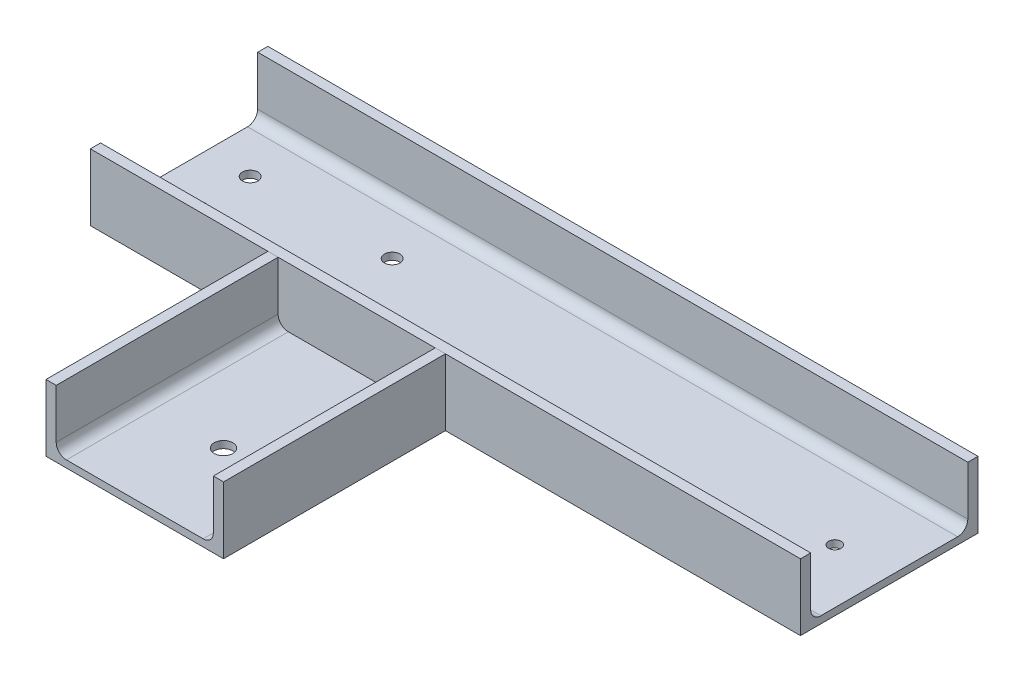
ISO-10303-21;
HEADER;
FILE_DESCRIPTION(('STEP AP214'),'2;1');
FILE_NAME('part.step','',(''),(''),'','','');
FILE_SCHEMA(('AUTOMOTIVE_DESIGN { 1 0 10303 214 1 1 1 1 }'));
ENDSEC;
DATA;
#1=APPLICATION_CONTEXT('core data for automotive mechanical design processes');
#2=APPLICATION_PROTOCOL_DEFINITION('international standard','automotive_design',2000,#1);
#3=PRODUCT_CONTEXT('',#1,'mechanical');
#4=PRODUCT('Part','Part','',(#3));
#5=PRODUCT_RELATED_PRODUCT_CATEGORY('part','',(#4));
#6=PRODUCT_DEFINITION_FORMATION('','',#4);
#7=PRODUCT_DEFINITION_CONTEXT('part definition',#1,'design');
#8=PRODUCT_DEFINITION('design','',#6,#7);
#9=PRODUCT_DEFINITION_SHAPE('','',#8);
#10=(LENGTH_UNIT() NAMED_UNIT(*) SI_UNIT(.MILLI.,.METRE.));
#11=(NAMED_UNIT(*) PLANE_ANGLE_UNIT() SI_UNIT($,.RADIAN.));
#12=(NAMED_UNIT(*) SI_UNIT($,.STERADIAN.) SOLID_ANGLE_UNIT());
#13=UNCERTAINTY_MEASURE_WITH_UNIT(LENGTH_MEASURE(1.E-05),#10,'distance_accuracy_value','');
#14=(GEOMETRIC_REPRESENTATION_CONTEXT(3) GLOBAL_UNCERTAINTY_ASSIGNED_CONTEXT((#13)) GLOBAL_UNIT_ASSIGNED_CONTEXT((#10,
#11,#12)) REPRESENTATION_CONTEXT('',''));
#15=CARTESIAN_POINT('',(0.,0.,0.));
#16=DIRECTION('',(0.,0.,1.));
#17=DIRECTION('',(1.,0.,0.));
#18=AXIS2_PLACEMENT_3D('',#15,#16,#17);
#19=CARTESIAN_POINT('',(-1.38777878078145E-13,75.0000000000003,250.));
#20=DIRECTION('',(-1.,0.,0.));
#21=DIRECTION('',(0.,-1.,0.));
#22=AXIS2_PLACEMENT_3D('',#19,#20,#21);
#23=PLANE('',#22);
#24=DIRECTION('',(0.,1.,0.));
#25=VECTOR('',#24,1.);
#26=CARTESIAN_POINT('',(-1.80411241501588E-13,75.0000000000003,0.));
#27=LINE('',#26,#25);
#28=CARTESIAN_POINT('',(0.,3.7470027081099E-13,0.));
#29=VERTEX_POINT('',#28);
#30=CARTESIAN_POINT('',(-1.80411241501588E-13,75.0000000000003,0.));
#31=VERTEX_POINT('',#30);
#32=EDGE_CURVE('E222',#29,#31,#27,.T.);
#33=ORIENTED_EDGE('',*,*,#32,.T.);
#34=DIRECTION('',(0.,0.,-1.));
#35=VECTOR('',#34,1.);
#36=CARTESIAN_POINT('',(-1.38777878078145E-13,75.0000000000003,250.));
#37=LINE('',#36,#35);
#38=CARTESIAN_POINT('',(-1.38777878078145E-13,75.0000000000003,250.));
#39=VERTEX_POINT('',#38);
#40=EDGE_CURVE('E14',#39,#31,#37,.T.);
#41=ORIENTED_EDGE('',*,*,#40,.F.);
#42=DIRECTION('',(0.,1.,0.));
#43=VECTOR('',#42,1.);
#44=CARTESIAN_POINT('',(-1.38777878078145E-13,75.0000000000003,250.));
#45=LINE('',#44,#43);
#46=CARTESIAN_POINT('',(1.2490009027033E-13,3.7470027081099E-13,250.));
#47=VERTEX_POINT('',#46);
#48=EDGE_CURVE('E240',#47,#39,#45,.T.);
#49=ORIENTED_EDGE('',*,*,#48,.F.);
#50=DIRECTION('',(0.,0.,-1.));
#51=VECTOR('',#50,1.);
#52=CARTESIAN_POINT('',(1.2490009027033E-13,3.7470027081099E-13,250.));
#53=LINE('',#52,#51);
#54=EDGE_CURVE('E218',#47,#29,#53,.T.);
#55=ORIENTED_EDGE('',*,*,#54,.T.);
#56=EDGE_LOOP('',(#33,#41,#49,#55));
#57=FACE_BOUND('',#56,.T.);
#58=ADVANCED_FACE('F113',(#57),#23,.F.);
#59=CARTESIAN_POINT('',(-1.38777878078145E-13,75.0000000000003,250.));
#60=DIRECTION('',(0.,-1.,0.));
#61=DIRECTION('',(1.,0.,0.));
#62=AXIS2_PLACEMENT_3D('',#59,#60,#61);
#63=PLANE('',#62);
#64=DIRECTION('',(-1.,0.,0.));
#65=VECTOR('',#64,1.);
#66=CARTESIAN_POINT('',(-1.80411241501588E-13,75.0000000000003,0.));
#67=LINE('',#66,#65);
#68=CARTESIAN_POINT('',(-11.5000000000002,75.0000000000003,0.));
#69=VERTEX_POINT('',#68);
#70=EDGE_CURVE('E225',#31,#69,#67,.T.);
#71=ORIENTED_EDGE('',*,*,#70,.T.);
#72=DIRECTION('',(0.,0.,-1.));
#73=VECTOR('',#72,1.);
#74=CARTESIAN_POINT('',(-11.5000000000001,75.0000000000003,250.));
#75=LINE('',#74,#73);
#76=CARTESIAN_POINT('',(-11.5000000000001,75.0000000000003,250.));
#77=VERTEX_POINT('',#76);
#78=EDGE_CURVE('E122',#77,#69,#75,.T.);
#79=ORIENTED_EDGE('',*,*,#78,.F.);
#80=DIRECTION('',(-1.,0.,0.));
#81=VECTOR('',#80,1.);
#82=CARTESIAN_POINT('',(-1.38777878078145E-13,75.0000000000003,250.));
#83=LINE('',#82,#81);
#84=EDGE_CURVE('E179',#39,#77,#83,.T.);
#85=ORIENTED_EDGE('',*,*,#84,.F.);
#86=ORIENTED_EDGE('',*,*,#40,.T.);
#87=EDGE_LOOP('',(#71,#79,#85,#86));
#88=FACE_BOUND('',#87,.T.);
#89=ADVANCED_FACE('F306',(#88),#63,.F.);
#90=CARTESIAN_POINT('',(-11.4999999999999,19.5000000000003,250.));
#91=DIRECTION('',(1.,0.,0.));
#92=DIRECTION('',(0.,1.,0.));
#93=AXIS2_PLACEMENT_3D('',#90,#91,#92);
#94=PLANE('',#93);
#95=DIRECTION('',(0.,-1.,0.));
#96=VECTOR('',#95,1.);
#97=CARTESIAN_POINT('',(-11.5,19.5000000000003,0.));
#98=LINE('',#97,#96);
#99=CARTESIAN_POINT('',(-11.5,19.5000000000003,0.));
#100=VERTEX_POINT('',#99);
#101=EDGE_CURVE('E227',#69,#100,#98,.T.);
#102=ORIENTED_EDGE('',*,*,#101,.T.);
#103=DIRECTION('',(0.,0.,-1.));
#104=VECTOR('',#103,1.);
#105=CARTESIAN_POINT('',(-11.4999999999999,19.5000000000003,250.));
#106=LINE('',#105,#104);
#107=CARTESIAN_POINT('',(-11.4999999999999,19.5000000000003,250.));
#108=VERTEX_POINT('',#107);
#109=EDGE_CURVE('E253',#108,#100,#106,.T.);
#110=ORIENTED_EDGE('',*,*,#109,.F.);
#111=DIRECTION('',(0.,-1.,0.));
#112=VECTOR('',#111,1.);
#113=CARTESIAN_POINT('',(-11.4999999999999,19.5000000000003,250.));
#114=LINE('',#113,#112);
#115=EDGE_CURVE('E262',#77,#108,#114,.T.);
#116=ORIENTED_EDGE('',*,*,#115,.F.);
#117=ORIENTED_EDGE('',*,*,#78,.T.);
#118=EDGE_LOOP('',(#102,#110,#116,#117));
#119=FACE_BOUND('',#118,.T.);
#120=ADVANCED_FACE('F260',(#119),#94,.F.);
#121=CARTESIAN_POINT('',(-22.9999999999999,19.5000000000003,250.));
#122=DIRECTION('',(0.,0.,-1.));
#123=DIRECTION('',(-1.,0.,0.));
#124=AXIS2_PLACEMENT_3D('',#121,#122,#123);
#125=CYLINDRICAL_SURFACE('',#124,11.5);
#126=CARTESIAN_POINT('',(-23.,19.5000000000003,0.));
#127=DIRECTION('',(0.,0.,-1.));
#128=DIRECTION('',(-1.,0.,0.));
#129=AXIS2_PLACEMENT_3D('',#126,#127,#128);
#130=CIRCLE('',#129,11.5);
#131=CARTESIAN_POINT('',(-22.9999999999999,8.00000000000027,0.));
#132=VERTEX_POINT('',#131);
#133=EDGE_CURVE('E229',#100,#132,#130,.T.);
#134=ORIENTED_EDGE('',*,*,#133,.T.);
#135=DIRECTION('',(0.,0.,-1.));
#136=VECTOR('',#135,1.);
#137=CARTESIAN_POINT('',(-22.9999999999999,8.00000000000027,250.));
#138=LINE('',#137,#136);
#139=CARTESIAN_POINT('',(-22.9999999999999,8.00000000000027,250.));
#140=VERTEX_POINT('',#139);
#141=EDGE_CURVE('E250',#140,#132,#138,.T.);
#142=ORIENTED_EDGE('',*,*,#141,.F.);
#143=CARTESIAN_POINT('',(-22.9999999999999,19.5000000000003,250.));
#144=DIRECTION('',(0.,0.,-1.));
#145=DIRECTION('',(-1.,0.,0.));
#146=AXIS2_PLACEMENT_3D('',#143,#144,#145);
#147=CIRCLE('',#146,11.5);
#148=EDGE_CURVE('E280',#108,#140,#147,.T.);
#149=ORIENTED_EDGE('',*,*,#148,.F.);
#150=ORIENTED_EDGE('',*,*,#109,.T.);
#151=EDGE_LOOP('',(#134,#142,#149,#150));
#152=FACE_BOUND('',#151,.T.);
#153=ADVANCED_FACE('F271',(#152),#125,.F.);
#154=CARTESIAN_POINT('',(-177.,7.99999999999971,250.));
#155=DIRECTION('',(0.,-1.,0.));
#156=DIRECTION('',(1.,0.,0.));
#157=AXIS2_PLACEMENT_3D('',#154,#155,#156);
#158=PLANE('',#157);
#159=CARTESIAN_POINT('',(-99.9999999999999,7.99999999999999,150.));
#160=DIRECTION('',(0.,1.,0.));
#161=DIRECTION('',(0.,0.,1.));
#162=AXIS2_PLACEMENT_3D('',#159,#160,#161);
#163=CIRCLE('',#162,10.5);
#164=CARTESIAN_POINT('',(-99.9999999999999,7.99999999999999,160.5));
#165=VERTEX_POINT('',#164);
#166=EDGE_CURVE('E288',#165,#165,#163,.T.);
#167=ORIENTED_EDGE('',*,*,#166,.F.);
#168=EDGE_LOOP('',(#167));
#169=FACE_BOUND('',#168,.T.);
#170=DIRECTION('',(-1.,0.,0.));
#171=VECTOR('',#170,1.);
#172=CARTESIAN_POINT('',(-177.,7.99999999999971,0.));
#173=LINE('',#172,#171);
#174=CARTESIAN_POINT('',(-177.,7.99999999999971,0.));
#175=VERTEX_POINT('',#174);
#176=EDGE_CURVE('E231',#132,#175,#173,.T.);
#177=ORIENTED_EDGE('',*,*,#176,.T.);
#178=DIRECTION('',(0.,0.,-1.));
#179=VECTOR('',#178,1.);
#180=CARTESIAN_POINT('',(-177.,7.99999999999971,250.));
#181=LINE('',#180,#179);
#182=CARTESIAN_POINT('',(-177.,7.99999999999971,250.));
#183=VERTEX_POINT('',#182);
#184=EDGE_CURVE('E247',#183,#175,#181,.T.);
#185=ORIENTED_EDGE('',*,*,#184,.F.);
#186=DIRECTION('',(-1.,0.,0.));
#187=VECTOR('',#186,1.);
#188=CARTESIAN_POINT('',(-177.,7.99999999999971,250.));
#189=LINE('',#188,#187);
#190=EDGE_CURVE('E277',#140,#183,#189,.T.);
#191=ORIENTED_EDGE('',*,*,#190,.F.);
#192=ORIENTED_EDGE('',*,*,#141,.T.);
#193=EDGE_LOOP('',(#177,#185,#191,#192));
#194=FACE_BOUND('',#193,.T.);
#195=ADVANCED_FACE('F275',(#169,#194),#158,.F.);
#196=CARTESIAN_POINT('',(-177.,19.4999999999997,250.));
#197=DIRECTION('',(0.,0.,-1.));
#198=DIRECTION('',(-1.,0.,0.));
#199=AXIS2_PLACEMENT_3D('',#196,#197,#198);
#200=CYLINDRICAL_SURFACE('',#199,11.5);
#201=CARTESIAN_POINT('',(-177.,19.4999999999997,0.));
#202=DIRECTION('',(0.,0.,-1.));
#203=DIRECTION('',(-1.,0.,0.));
#204=AXIS2_PLACEMENT_3D('',#201,#202,#203);
#205=CIRCLE('',#204,11.5);
#206=CARTESIAN_POINT('',(-188.5,19.4999999999997,0.));
#207=VERTEX_POINT('',#206);
#208=EDGE_CURVE('E233',#175,#207,#205,.T.);
#209=ORIENTED_EDGE('',*,*,#208,.T.);
#210=DIRECTION('',(0.,0.,-1.));
#211=VECTOR('',#210,1.);
#212=CARTESIAN_POINT('',(-188.5,19.4999999999997,250.));
#213=LINE('',#212,#211);
#214=CARTESIAN_POINT('',(-188.5,19.4999999999997,250.));
#215=VERTEX_POINT('',#214);
#216=EDGE_CURVE('E244',#215,#207,#213,.T.);
#217=ORIENTED_EDGE('',*,*,#216,.F.);
#218=CARTESIAN_POINT('',(-177.,19.4999999999997,250.));
#219=DIRECTION('',(0.,0.,-1.));
#220=DIRECTION('',(-1.,0.,0.));
#221=AXIS2_PLACEMENT_3D('',#218,#219,#220);
#222=CIRCLE('',#221,11.5);
#223=EDGE_CURVE('E279',#183,#215,#222,.T.);
#224=ORIENTED_EDGE('',*,*,#223,.F.);
#225=ORIENTED_EDGE('',*,*,#184,.T.);
#226=EDGE_LOOP('',(#209,#217,#224,#225));
#227=FACE_BOUND('',#226,.T.);
#228=ADVANCED_FACE('F318',(#227),#200,.F.);
#229=CARTESIAN_POINT('',(-188.5,19.4999999999997,250.));
#230=DIRECTION('',(-1.,0.,0.));
#231=DIRECTION('',(0.,-1.,0.));
#232=AXIS2_PLACEMENT_3D('',#229,#230,#231);
#233=PLANE('',#232);
#234=DIRECTION('',(0.,1.,0.));
#235=VECTOR('',#234,1.);
#236=CARTESIAN_POINT('',(-188.5,19.4999999999997,0.));
#237=LINE('',#236,#235);
#238=CARTESIAN_POINT('',(-188.5,74.9999999999997,0.));
#239=VERTEX_POINT('',#238);
#240=EDGE_CURVE('E235',#207,#239,#237,.T.);
#241=ORIENTED_EDGE('',*,*,#240,.T.);
#242=DIRECTION('',(0.,0.,-1.));
#243=VECTOR('',#242,1.);
#244=CARTESIAN_POINT('',(-188.5,74.9999999999997,250.));
#245=LINE('',#244,#243);
#246=CARTESIAN_POINT('',(-188.5,74.9999999999997,250.));
#247=VERTEX_POINT('',#246);
#248=EDGE_CURVE('E213',#247,#239,#245,.T.);
#249=ORIENTED_EDGE('',*,*,#248,.F.);
#250=DIRECTION('',(0.,1.,0.));
#251=VECTOR('',#250,1.);
#252=CARTESIAN_POINT('',(-188.5,19.4999999999997,250.));
#253=LINE('',#252,#251);
#254=EDGE_CURVE('E204',#215,#247,#253,.T.);
#255=ORIENTED_EDGE('',*,*,#254,.F.);
#256=ORIENTED_EDGE('',*,*,#216,.T.);
#257=EDGE_LOOP('',(#241,#249,#255,#256));
#258=FACE_BOUND('',#257,.T.);
#259=ADVANCED_FACE('F315',(#258),#233,.F.);
#260=CARTESIAN_POINT('',(-200.,74.9999999999996,250.));
#261=DIRECTION('',(0.,-1.,0.));
#262=DIRECTION('',(1.,0.,0.));
#263=AXIS2_PLACEMENT_3D('',#260,#261,#262);
#264=PLANE('',#263);
#265=DIRECTION('',(-1.,0.,0.));
#266=VECTOR('',#265,1.);
#267=CARTESIAN_POINT('',(-200.,74.9999999999996,0.));
#268=LINE('',#267,#266);
#269=CARTESIAN_POINT('',(-200.,74.9999999999996,0.));
#270=VERTEX_POINT('',#269);
#271=EDGE_CURVE('E212',#239,#270,#268,.T.);
#272=ORIENTED_EDGE('',*,*,#271,.T.);
#273=DIRECTION('',(0.,0.,-1.));
#274=VECTOR('',#273,1.);
#275=CARTESIAN_POINT('',(-200.,74.9999999999996,250.));
#276=LINE('',#275,#274);
#277=CARTESIAN_POINT('',(-200.,74.9999999999996,250.));
#278=VERTEX_POINT('',#277);
#279=EDGE_CURVE('E209',#278,#270,#276,.T.);
#280=ORIENTED_EDGE('',*,*,#279,.F.);
#281=DIRECTION('',(-1.,0.,0.));
#282=VECTOR('',#281,1.);
#283=CARTESIAN_POINT('',(-200.,74.9999999999996,250.));
#284=LINE('',#283,#282);
#285=EDGE_CURVE('E198',#247,#278,#284,.T.);
#286=ORIENTED_EDGE('',*,*,#285,.F.);
#287=ORIENTED_EDGE('',*,*,#248,.T.);
#288=EDGE_LOOP('',(#272,#280,#286,#287));
#289=FACE_BOUND('',#288,.T.);
#290=ADVANCED_FACE('F210',(#289),#264,.F.);
#291=CARTESIAN_POINT('',(-200.,74.9999999999996,250.));
#292=DIRECTION('',(1.,0.,0.));
#293=DIRECTION('',(0.,1.,0.));
#294=AXIS2_PLACEMENT_3D('',#291,#292,#293);
#295=PLANE('',#294);
#296=DIRECTION('',(0.,-1.,0.));
#297=VECTOR('',#296,1.);
#298=CARTESIAN_POINT('',(-200.,74.9999999999996,0.));
#299=LINE('',#298,#297);
#300=CARTESIAN_POINT('',(-200.,-3.79107148188894E-13,0.));
#301=VERTEX_POINT('',#300);
#302=EDGE_CURVE('E165',#270,#301,#299,.T.);
#303=ORIENTED_EDGE('',*,*,#302,.T.);
#304=DIRECTION('',(0.,0.,-1.));
#305=VECTOR('',#304,1.);
#306=CARTESIAN_POINT('',(-200.,-3.79107148188894E-13,250.));
#307=LINE('',#306,#305);
#308=CARTESIAN_POINT('',(-200.,-3.79107148188894E-13,250.));
#309=VERTEX_POINT('',#308);
#310=EDGE_CURVE('E214',#309,#301,#307,.T.);
#311=ORIENTED_EDGE('',*,*,#310,.F.);
#312=DIRECTION('',(0.,-1.,0.));
#313=VECTOR('',#312,1.);
#314=CARTESIAN_POINT('',(-200.,74.9999999999996,250.));
#315=LINE('',#314,#313);
#316=EDGE_CURVE('E202',#278,#309,#315,.T.);
#317=ORIENTED_EDGE('',*,*,#316,.F.);
#318=ORIENTED_EDGE('',*,*,#279,.T.);
#319=EDGE_LOOP('',(#303,#311,#317,#318));
#320=FACE_BOUND('',#319,.T.);
#321=ADVANCED_FACE('F216',(#320),#295,.F.);
#322=CARTESIAN_POINT('',(1.2490009027033E-13,3.7470027081099E-13,250.));
#323=DIRECTION('',(0.,1.,0.));
#324=DIRECTION('',(-1.,0.,0.));
#325=AXIS2_PLACEMENT_3D('',#322,#323,#324);
#326=PLANE('',#325);
#327=CARTESIAN_POINT('',(-99.9999999999999,0.,150.));
#328=DIRECTION('',(0.,1.,0.));
#329=DIRECTION('',(-1.,0.,0.));
#330=AXIS2_PLACEMENT_3D('',#327,#328,#329);
#331=CIRCLE('',#330,10.5);
#332=CARTESIAN_POINT('',(-110.5,0.,150.));
#333=VERTEX_POINT('',#332);
#334=EDGE_CURVE('E116',#333,#333,#331,.T.);
#335=ORIENTED_EDGE('',*,*,#334,.T.);
#336=EDGE_LOOP('',(#335));
#337=FACE_BOUND('',#336,.T.);
#338=DIRECTION('',(1.,0.,0.));
#339=VECTOR('',#338,1.);
#340=CARTESIAN_POINT('',(0.,3.7470027081099E-13,0.));
#341=LINE('',#340,#339);
#342=EDGE_CURVE('E171',#301,#29,#341,.T.);
#343=ORIENTED_EDGE('',*,*,#342,.T.);
#344=ORIENTED_EDGE('',*,*,#54,.F.);
#345=DIRECTION('',(1.,0.,0.));
#346=VECTOR('',#345,1.);
#347=CARTESIAN_POINT('',(1.2490009027033E-13,3.7470027081099E-13,250.));
#348=LINE('',#347,#346);
#349=EDGE_CURVE('E130',#309,#47,#348,.T.);
#350=ORIENTED_EDGE('',*,*,#349,.F.);
#351=ORIENTED_EDGE('',*,*,#310,.T.);
#352=EDGE_LOOP('',(#343,#344,#350,#351));
#353=FACE_BOUND('',#352,.T.);
#354=ADVANCED_FACE('F295',(#337,#353),#326,.F.);
#355=CARTESIAN_POINT('',(-177.,19.4999999999997,250.));
#356=DIRECTION('',(0.,0.,-1.));
#357=DIRECTION('',(-1.,0.,0.));
#358=AXIS2_PLACEMENT_3D('',#355,#356,#357);
#359=PLANE('',#358);
#360=ORIENTED_EDGE('',*,*,#48,.T.);
#361=ORIENTED_EDGE('',*,*,#84,.T.);
#362=ORIENTED_EDGE('',*,*,#115,.T.);
#363=ORIENTED_EDGE('',*,*,#148,.T.);
#364=ORIENTED_EDGE('',*,*,#190,.T.);
#365=ORIENTED_EDGE('',*,*,#223,.T.);
#366=ORIENTED_EDGE('',*,*,#254,.T.);
#367=ORIENTED_EDGE('',*,*,#285,.T.);
#368=ORIENTED_EDGE('',*,*,#316,.T.);
#369=ORIENTED_EDGE('',*,*,#349,.T.);
#370=EDGE_LOOP('',(#360,#361,#362,#363,#364,#365,#366,#367,#368,#369));
#371=FACE_BOUND('',#370,.T.);
#372=ADVANCED_FACE('F200',(#371),#359,.F.);
#373=CARTESIAN_POINT('',(-177.,19.4999999999997,0.));
#374=DIRECTION('',(0.,0.,-1.));
#375=DIRECTION('',(-1.,0.,0.));
#376=AXIS2_PLACEMENT_3D('',#373,#374,#375);
#377=PLANE('',#376);
#378=ORIENTED_EDGE('',*,*,#32,.F.);
#379=ORIENTED_EDGE('',*,*,#342,.F.);
#380=ORIENTED_EDGE('',*,*,#302,.F.);
#381=ORIENTED_EDGE('',*,*,#271,.F.);
#382=ORIENTED_EDGE('',*,*,#240,.F.);
#383=ORIENTED_EDGE('',*,*,#208,.F.);
#384=ORIENTED_EDGE('',*,*,#176,.F.);
#385=ORIENTED_EDGE('',*,*,#133,.F.);
#386=ORIENTED_EDGE('',*,*,#101,.F.);
#387=ORIENTED_EDGE('',*,*,#70,.F.);
#388=EDGE_LOOP('',(#378,#379,#380,#381,#382,#383,#384,#385,#386,#387));
#389=FACE_BOUND('',#388,.T.);
#390=ADVANCED_FACE('F266',(#389),#377,.T.);
#391=CARTESIAN_POINT('',(-99.9999999999999,7.99999999999999,150.));
#392=DIRECTION('',(0.,1.,0.));
#393=DIRECTION('',(0.,0.,1.));
#394=AXIS2_PLACEMENT_3D('',#391,#392,#393);
#395=CYLINDRICAL_SURFACE('',#394,10.5);
#396=ORIENTED_EDGE('',*,*,#166,.T.);
#397=EDGE_LOOP('',(#396));
#398=FACE_BOUND('',#397,.T.);
#399=ORIENTED_EDGE('',*,*,#334,.F.);
#400=EDGE_LOOP('',(#399));
#401=FACE_BOUND('',#400,.T.);
#402=ADVANCED_FACE('F297',(#398,#401),#395,.F.);
#403=CLOSED_SHELL('',(#58,#89,#120,#153,#195,#228,#259,#290,#321,#354,#372,#390,#402));
#404=MANIFOLD_SOLID_BREP('B2',#403);
#405=CARTESIAN_POINT('',(-400.,75.,-1.58990769284857E-13));
#406=DIRECTION('',(0.,0.,-1.));
#407=DIRECTION('',(0.,1.,0.));
#408=AXIS2_PLACEMENT_3D('',#405,#406,#407);
#409=PLANE('',#408);
#410=DIRECTION('',(0.,1.,0.));
#411=VECTOR('',#410,1.);
#412=CARTESIAN_POINT('',(400.,75.,-4.03920129114328E-13));
#413=LINE('',#412,#411);
#414=CARTESIAN_POINT('',(400.,0.,-1.40834381901946E-13));
#415=VERTEX_POINT('',#414);
#416=CARTESIAN_POINT('',(400.,75.,-4.03920129114328E-13));
#417=VERTEX_POINT('',#416);
#418=EDGE_CURVE('E574',#415,#417,#413,.T.);
#419=ORIENTED_EDGE('',*,*,#418,.T.);
#420=DIRECTION('',(1.,0.,0.));
#421=VECTOR('',#420,1.);
#422=CARTESIAN_POINT('',(-400.,75.,-1.58990769284857E-13));
#423=LINE('',#422,#421);
#424=CARTESIAN_POINT('',(-400.,75.,-1.58990769284857E-13));
#425=VERTEX_POINT('',#424);
#426=EDGE_CURVE('E111',#425,#417,#423,.T.);
#427=ORIENTED_EDGE('',*,*,#426,.F.);
#428=DIRECTION('',(0.,1.,0.));
#429=VECTOR('',#428,1.);
#430=CARTESIAN_POINT('',(-400.,75.,-1.58990769284857E-13));
#431=LINE('',#430,#429);
#432=CARTESIAN_POINT('',(-400.,0.,1.04094977927525E-13));
#433=VERTEX_POINT('',#432);
#434=EDGE_CURVE('E593',#433,#425,#431,.T.);
#435=ORIENTED_EDGE('',*,*,#434,.F.);
#436=DIRECTION('',(1.,0.,0.));
#437=VECTOR('',#436,1.);
#438=CARTESIAN_POINT('',(-400.,0.,1.04094977927525E-13));
#439=LINE('',#438,#437);
#440=EDGE_CURVE('E570',#433,#415,#439,.T.);
#441=ORIENTED_EDGE('',*,*,#440,.T.);
#442=EDGE_LOOP('',(#419,#427,#435,#441));
#443=FACE_BOUND('',#442,.T.);
#444=ADVANCED_FACE('F464',(#443),#409,.F.);
#445=CARTESIAN_POINT('',(-400.,75.,-1.58990769284857E-13));
#446=DIRECTION('',(0.,-1.,0.));
#447=DIRECTION('',(0.,0.,-1.));
#448=AXIS2_PLACEMENT_3D('',#445,#446,#447);
#449=PLANE('',#448);
#450=DIRECTION('',(0.,0.,-1.));
#451=VECTOR('',#450,1.);
#452=CARTESIAN_POINT('',(400.,75.,-4.03920129114328E-13));
#453=LINE('',#452,#451);
#454=CARTESIAN_POINT('',(400.,74.9999999999999,-11.5000000000004));
#455=VERTEX_POINT('',#454);
#456=EDGE_CURVE('E577',#417,#455,#453,.T.);
#457=ORIENTED_EDGE('',*,*,#456,.T.);
#458=DIRECTION('',(1.,0.,0.));
#459=VECTOR('',#458,1.);
#460=CARTESIAN_POINT('',(-400.,74.9999999999999,-11.5000000000001));
#461=LINE('',#460,#459);
#462=CARTESIAN_POINT('',(-400.,74.9999999999999,-11.5000000000001));
#463=VERTEX_POINT('',#462);
#464=EDGE_CURVE('E473',#463,#455,#461,.T.);
#465=ORIENTED_EDGE('',*,*,#464,.F.);
#466=DIRECTION('',(0.,0.,-1.));
#467=VECTOR('',#466,1.);
#468=CARTESIAN_POINT('',(-400.,75.,-1.58990769284857E-13));
#469=LINE('',#468,#467);
#470=EDGE_CURVE('E531',#425,#463,#469,.T.);
#471=ORIENTED_EDGE('',*,*,#470,.F.);
#472=ORIENTED_EDGE('',*,*,#426,.T.);
#473=EDGE_LOOP('',(#457,#465,#471,#472));
#474=FACE_BOUND('',#473,.T.);
#475=ADVANCED_FACE('F678',(#474),#449,.F.);
#476=CARTESIAN_POINT('',(-400.,19.4999999999999,-11.4999999999999));
#477=DIRECTION('',(0.,0.,1.));
#478=DIRECTION('',(0.,-1.,0.));
#479=AXIS2_PLACEMENT_3D('',#476,#477,#478);
#480=PLANE('',#479);
#481=DIRECTION('',(0.,-1.,0.));
#482=VECTOR('',#481,1.);
#483=CARTESIAN_POINT('',(400.,19.4999999999999,-11.5000000000002));
#484=LINE('',#483,#482);
#485=CARTESIAN_POINT('',(400.,19.4999999999999,-11.5000000000002));
#486=VERTEX_POINT('',#485);
#487=EDGE_CURVE('E580',#455,#486,#484,.T.);
#488=ORIENTED_EDGE('',*,*,#487,.T.);
#489=DIRECTION('',(1.,0.,0.));
#490=VECTOR('',#489,1.);
#491=CARTESIAN_POINT('',(-400.,19.4999999999999,-11.4999999999999));
#492=LINE('',#491,#490);
#493=CARTESIAN_POINT('',(-400.,19.4999999999999,-11.4999999999999));
#494=VERTEX_POINT('',#493);
#495=EDGE_CURVE('E606',#494,#486,#492,.T.);
#496=ORIENTED_EDGE('',*,*,#495,.F.);
#497=DIRECTION('',(0.,-1.,0.));
#498=VECTOR('',#497,1.);
#499=CARTESIAN_POINT('',(-400.,19.4999999999999,-11.4999999999999));
#500=LINE('',#499,#498);
#501=EDGE_CURVE('E642',#463,#494,#500,.T.);
#502=ORIENTED_EDGE('',*,*,#501,.F.);
#503=ORIENTED_EDGE('',*,*,#464,.T.);
#504=EDGE_LOOP('',(#488,#496,#502,#503));
#505=FACE_BOUND('',#504,.T.);
#506=ADVANCED_FACE('F682',(#505),#480,.F.);
#507=CARTESIAN_POINT('',(-400.,19.4999999999999,-22.9999999999999));
#508=DIRECTION('',(1.,0.,0.));
#509=DIRECTION('',(0.,0.,-1.));
#510=AXIS2_PLACEMENT_3D('',#507,#508,#509);
#511=CYLINDRICAL_SURFACE('',#510,11.5);
#512=CARTESIAN_POINT('',(400.,19.4999999999999,-23.0000000000002));
#513=DIRECTION('',(1.,0.,0.));
#514=DIRECTION('',(0.,0.,-1.));
#515=AXIS2_PLACEMENT_3D('',#512,#513,#514);
#516=CIRCLE('',#515,11.5);
#517=CARTESIAN_POINT('',(400.,7.9999999999999,-23.0000000000002));
#518=VERTEX_POINT('',#517);
#519=EDGE_CURVE('E582',#486,#518,#516,.T.);
#520=ORIENTED_EDGE('',*,*,#519,.T.);
#521=DIRECTION('',(1.,0.,0.));
#522=VECTOR('',#521,1.);
#523=CARTESIAN_POINT('',(-400.,7.9999999999999,-22.9999999999999));
#524=LINE('',#523,#522);
#525=CARTESIAN_POINT('',(-400.,7.9999999999999,-22.9999999999999));
#526=VERTEX_POINT('',#525);
#527=EDGE_CURVE('E603',#526,#518,#524,.T.);
#528=ORIENTED_EDGE('',*,*,#527,.F.);
#529=CARTESIAN_POINT('',(-400.,19.4999999999999,-22.9999999999999));
#530=DIRECTION('',(1.,0.,0.));
#531=DIRECTION('',(0.,0.,-1.));
#532=AXIS2_PLACEMENT_3D('',#529,#530,#531);
#533=CIRCLE('',#532,11.5);
#534=EDGE_CURVE('E644',#494,#526,#533,.T.);
#535=ORIENTED_EDGE('',*,*,#534,.F.);
#536=ORIENTED_EDGE('',*,*,#495,.T.);
#537=EDGE_LOOP('',(#520,#528,#535,#536));
#538=FACE_BOUND('',#537,.T.);
#539=ADVANCED_FACE('F686',(#538),#511,.F.);
#540=CARTESIAN_POINT('',(-400.,7.99999999999934,-177.));
#541=DIRECTION('',(0.,-1.,0.));
#542=DIRECTION('',(0.,0.,-1.));
#543=AXIS2_PLACEMENT_3D('',#540,#541,#542);
#544=PLANE('',#543);
#545=CARTESIAN_POINT('',(-350.,7.99999999999951,-130.));
#546=DIRECTION('',(0.,1.,0.));
#547=DIRECTION('',(0.,0.,1.));
#548=AXIS2_PLACEMENT_3D('',#545,#546,#547);
#549=CIRCLE('',#548,8.74999999999998);
#550=CARTESIAN_POINT('',(-350.,7.99999999999954,-121.25));
#551=VERTEX_POINT('',#550);
#552=EDGE_CURVE('E627',#551,#551,#549,.T.);
#553=ORIENTED_EDGE('',*,*,#552,.F.);
#554=EDGE_LOOP('',(#553));
#555=FACE_BOUND('',#554,.T.);
#556=CARTESIAN_POINT('',(-190.,7.99999999999951,-130.));
#557=DIRECTION('',(0.,1.,0.));
#558=DIRECTION('',(0.,0.,1.));
#559=AXIS2_PLACEMENT_3D('',#556,#557,#558);
#560=CIRCLE('',#559,8.75000000000001);
#561=CARTESIAN_POINT('',(-190.,7.99999999999954,-121.25));
#562=VERTEX_POINT('',#561);
#563=EDGE_CURVE('E617',#562,#562,#560,.T.);
#564=ORIENTED_EDGE('',*,*,#563,.F.);
#565=EDGE_LOOP('',(#564));
#566=FACE_BOUND('',#565,.T.);
#567=CARTESIAN_POINT('',(-190.,7.99999999999973,-69.9999999999999));
#568=DIRECTION('',(0.,1.,0.));
#569=DIRECTION('',(0.,0.,1.));
#570=AXIS2_PLACEMENT_3D('',#567,#568,#569);
#571=CIRCLE('',#570,8.75000000000001);
#572=CARTESIAN_POINT('',(-190.,7.99999999999976,-61.2499999999999));
#573=VERTEX_POINT('',#572);
#574=EDGE_CURVE('E614',#573,#573,#571,.T.);
#575=ORIENTED_EDGE('',*,*,#574,.F.);
#576=EDGE_LOOP('',(#575));
#577=FACE_BOUND('',#576,.T.);
#578=CARTESIAN_POINT('',(-350.,7.99999999999973,-69.9999999999999));
#579=DIRECTION('',(0.,1.,0.));
#580=DIRECTION('',(0.,0.,1.));
#581=AXIS2_PLACEMENT_3D('',#578,#579,#580);
#582=CIRCLE('',#581,8.74999999999998);
#583=CARTESIAN_POINT('',(-350.,7.99999999999976,-61.2499999999999));
#584=VERTEX_POINT('',#583);
#585=EDGE_CURVE('E613',#584,#584,#582,.T.);
#586=ORIENTED_EDGE('',*,*,#585,.F.);
#587=EDGE_LOOP('',(#586));
#588=FACE_BOUND('',#587,.T.);
#589=CARTESIAN_POINT('',(338.671963181592,7.99999999999962,-100.));
#590=DIRECTION('',(0.,1.,0.));
#591=DIRECTION('',(0.,0.,1.));
#592=AXIS2_PLACEMENT_3D('',#589,#590,#591);
#593=CIRCLE('',#592,7.00000000000001);
#594=CARTESIAN_POINT('',(338.671963181592,7.99999999999964,-93.0000000000001));
#595=VERTEX_POINT('',#594);
#596=EDGE_CURVE('E635',#595,#595,#593,.T.);
#597=ORIENTED_EDGE('',*,*,#596,.F.);
#598=EDGE_LOOP('',(#597));
#599=FACE_BOUND('',#598,.T.);
#600=DIRECTION('',(0.,0.,-1.));
#601=VECTOR('',#600,1.);
#602=CARTESIAN_POINT('',(400.,7.99999999999934,-177.));
#603=LINE('',#602,#601);
#604=CARTESIAN_POINT('',(400.,7.99999999999933,-177.));
#605=VERTEX_POINT('',#604);
#606=EDGE_CURVE('E584',#518,#605,#603,.T.);
#607=ORIENTED_EDGE('',*,*,#606,.T.);
#608=DIRECTION('',(1.,0.,0.));
#609=VECTOR('',#608,1.);
#610=CARTESIAN_POINT('',(-400.,7.99999999999933,-177.));
#611=LINE('',#610,#609);
#612=CARTESIAN_POINT('',(-400.,7.99999999999933,-177.));
#613=VERTEX_POINT('',#612);
#614=EDGE_CURVE('E600',#613,#605,#611,.T.);
#615=ORIENTED_EDGE('',*,*,#614,.F.);
#616=DIRECTION('',(0.,0.,-1.));
#617=VECTOR('',#616,1.);
#618=CARTESIAN_POINT('',(-400.,7.99999999999934,-177.));
#619=LINE('',#618,#617);
#620=EDGE_CURVE('E646',#526,#613,#619,.T.);
#621=ORIENTED_EDGE('',*,*,#620,.F.);
#622=ORIENTED_EDGE('',*,*,#527,.T.);
#623=EDGE_LOOP('',(#607,#615,#621,#622));
#624=FACE_BOUND('',#623,.T.);
#625=ADVANCED_FACE('F692',(#555,#566,#577,#588,#599,#624),#544,.F.);
#626=CARTESIAN_POINT('',(-400.,19.4999999999993,-177.));
#627=DIRECTION('',(1.,0.,0.));
#628=DIRECTION('',(0.,0.,-1.));
#629=AXIS2_PLACEMENT_3D('',#626,#627,#628);
#630=CYLINDRICAL_SURFACE('',#629,11.5);
#631=CARTESIAN_POINT('',(400.,19.4999999999993,-177.));
#632=DIRECTION('',(1.,0.,0.));
#633=DIRECTION('',(0.,0.,-1.));
#634=AXIS2_PLACEMENT_3D('',#631,#632,#633);
#635=CIRCLE('',#634,11.5);
#636=CARTESIAN_POINT('',(400.,19.4999999999993,-188.5));
#637=VERTEX_POINT('',#636);
#638=EDGE_CURVE('E586',#605,#637,#635,.T.);
#639=ORIENTED_EDGE('',*,*,#638,.T.);
#640=DIRECTION('',(1.,0.,0.));
#641=VECTOR('',#640,1.);
#642=CARTESIAN_POINT('',(-400.,19.4999999999993,-188.5));
#643=LINE('',#642,#641);
#644=CARTESIAN_POINT('',(-400.,19.4999999999993,-188.5));
#645=VERTEX_POINT('',#644);
#646=EDGE_CURVE('E597',#645,#637,#643,.T.);
#647=ORIENTED_EDGE('',*,*,#646,.F.);
#648=CARTESIAN_POINT('',(-400.,19.4999999999993,-177.));
#649=DIRECTION('',(1.,0.,0.));
#650=DIRECTION('',(0.,0.,-1.));
#651=AXIS2_PLACEMENT_3D('',#648,#649,#650);
#652=CIRCLE('',#651,11.5);
#653=EDGE_CURVE('E648',#613,#645,#652,.T.);
#654=ORIENTED_EDGE('',*,*,#653,.F.);
#655=ORIENTED_EDGE('',*,*,#614,.T.);
#656=EDGE_LOOP('',(#639,#647,#654,#655));
#657=FACE_BOUND('',#656,.T.);
#658=ADVANCED_FACE('F654',(#657),#630,.F.);
#659=CARTESIAN_POINT('',(-400.,19.4999999999993,-188.5));
#660=DIRECTION('',(0.,0.,-1.));
#661=DIRECTION('',(0.,1.,0.));
#662=AXIS2_PLACEMENT_3D('',#659,#660,#661);
#663=PLANE('',#662);
#664=DIRECTION('',(0.,1.,0.));
#665=VECTOR('',#664,1.);
#666=CARTESIAN_POINT('',(400.,19.4999999999993,-188.5));
#667=LINE('',#666,#665);
#668=CARTESIAN_POINT('',(400.,74.9999999999993,-188.5));
#669=VERTEX_POINT('',#668);
#670=EDGE_CURVE('E588',#637,#669,#667,.T.);
#671=ORIENTED_EDGE('',*,*,#670,.T.);
#672=DIRECTION('',(1.,0.,0.));
#673=VECTOR('',#672,1.);
#674=CARTESIAN_POINT('',(-400.,74.9999999999993,-188.5));
#675=LINE('',#674,#673);
#676=CARTESIAN_POINT('',(-400.,74.9999999999993,-188.5));
#677=VERTEX_POINT('',#676);
#678=EDGE_CURVE('E565',#677,#669,#675,.T.);
#679=ORIENTED_EDGE('',*,*,#678,.F.);
#680=DIRECTION('',(0.,1.,0.));
#681=VECTOR('',#680,1.);
#682=CARTESIAN_POINT('',(-400.,19.4999999999993,-188.5));
#683=LINE('',#682,#681);
#684=EDGE_CURVE('E556',#645,#677,#683,.T.);
#685=ORIENTED_EDGE('',*,*,#684,.F.);
#686=ORIENTED_EDGE('',*,*,#646,.T.);
#687=EDGE_LOOP('',(#671,#679,#685,#686));
#688=FACE_BOUND('',#687,.T.);
#689=ADVANCED_FACE('F658',(#688),#663,.F.);
#690=CARTESIAN_POINT('',(-400.,74.9999999999992,-200.));
#691=DIRECTION('',(0.,-1.,0.));
#692=DIRECTION('',(0.,0.,-1.));
#693=AXIS2_PLACEMENT_3D('',#690,#691,#692);
#694=PLANE('',#693);
#695=DIRECTION('',(0.,0.,-1.));
#696=VECTOR('',#695,1.);
#697=CARTESIAN_POINT('',(400.,74.9999999999992,-200.));
#698=LINE('',#697,#696);
#699=CARTESIAN_POINT('',(400.,74.9999999999992,-200.));
#700=VERTEX_POINT('',#699);
#701=EDGE_CURVE('E564',#669,#700,#698,.T.);
#702=ORIENTED_EDGE('',*,*,#701,.T.);
#703=DIRECTION('',(1.,0.,0.));
#704=VECTOR('',#703,1.);
#705=CARTESIAN_POINT('',(-400.,74.9999999999992,-200.));
#706=LINE('',#705,#704);
#707=CARTESIAN_POINT('',(-400.,74.9999999999992,-200.));
#708=VERTEX_POINT('',#707);
#709=EDGE_CURVE('E561',#708,#700,#706,.T.);
#710=ORIENTED_EDGE('',*,*,#709,.F.);
#711=DIRECTION('',(0.,0.,-1.));
#712=VECTOR('',#711,1.);
#713=CARTESIAN_POINT('',(-400.,74.9999999999992,-200.));
#714=LINE('',#713,#712);
#715=EDGE_CURVE('E550',#677,#708,#714,.T.);
#716=ORIENTED_EDGE('',*,*,#715,.F.);
#717=ORIENTED_EDGE('',*,*,#678,.T.);
#718=EDGE_LOOP('',(#702,#710,#716,#717));
#719=FACE_BOUND('',#718,.T.);
#720=ADVANCED_FACE('F562',(#719),#694,.F.);
#721=CARTESIAN_POINT('',(-400.,74.9999999999992,-200.));
#722=DIRECTION('',(0.,0.,1.));
#723=DIRECTION('',(0.,-1.,0.));
#724=AXIS2_PLACEMENT_3D('',#721,#722,#723);
#725=PLANE('',#724);
#726=DIRECTION('',(0.,-1.,0.));
#727=VECTOR('',#726,1.);
#728=CARTESIAN_POINT('',(400.,74.9999999999992,-200.));
#729=LINE('',#728,#727);
#730=CARTESIAN_POINT('',(400.,-7.53807418999884E-13,-200.));
#731=VERTEX_POINT('',#730);
#732=EDGE_CURVE('E517',#700,#731,#729,.T.);
#733=ORIENTED_EDGE('',*,*,#732,.T.);
#734=DIRECTION('',(1.,0.,0.));
#735=VECTOR('',#734,1.);
#736=CARTESIAN_POINT('',(-400.,-7.53807418999884E-13,-200.));
#737=LINE('',#736,#735);
#738=CARTESIAN_POINT('',(-400.,-7.53807418999884E-13,-200.));
#739=VERTEX_POINT('',#738);
#740=EDGE_CURVE('E566',#739,#731,#737,.T.);
#741=ORIENTED_EDGE('',*,*,#740,.F.);
#742=DIRECTION('',(0.,-1.,0.));
#743=VECTOR('',#742,1.);
#744=CARTESIAN_POINT('',(-400.,74.9999999999992,-200.));
#745=LINE('',#744,#743);
#746=EDGE_CURVE('E554',#708,#739,#745,.T.);
#747=ORIENTED_EDGE('',*,*,#746,.F.);
#748=ORIENTED_EDGE('',*,*,#709,.T.);
#749=EDGE_LOOP('',(#733,#741,#747,#748));
#750=FACE_BOUND('',#749,.T.);
#751=ADVANCED_FACE('F568',(#750),#725,.F.);
#752=CARTESIAN_POINT('',(-400.,0.,1.04094977927525E-13));
#753=DIRECTION('',(0.,1.,0.));
#754=DIRECTION('',(0.,0.,1.));
#755=AXIS2_PLACEMENT_3D('',#752,#753,#754);
#756=PLANE('',#755);
#757=CARTESIAN_POINT('',(-350.,-4.8919202022546E-13,-130.));
#758=DIRECTION('',(0.,1.,0.));
#759=DIRECTION('',(0.,0.,1.));
#760=AXIS2_PLACEMENT_3D('',#757,#758,#759);
#761=CIRCLE('',#760,8.74999999999998);
#762=CARTESIAN_POINT('',(-350.,-4.56212945644215E-13,-121.25));
#763=VERTEX_POINT('',#762);
#764=EDGE_CURVE('E467',#763,#763,#761,.T.);
#765=ORIENTED_EDGE('',*,*,#764,.T.);
#766=EDGE_LOOP('',(#765));
#767=FACE_BOUND('',#766,.T.);
#768=CARTESIAN_POINT('',(-190.,-4.8919202022546E-13,-130.));
#769=DIRECTION('',(0.,1.,0.));
#770=DIRECTION('',(0.,0.,1.));
#771=AXIS2_PLACEMENT_3D('',#768,#769,#770);
#772=CIRCLE('',#771,8.74999999999999);
#773=CARTESIAN_POINT('',(-190.,-4.56212945644215E-13,-121.25));
#774=VERTEX_POINT('',#773);
#775=EDGE_CURVE('E615',#774,#774,#772,.T.);
#776=ORIENTED_EDGE('',*,*,#775,.T.);
#777=EDGE_LOOP('',(#776));
#778=FACE_BOUND('',#777,.T.);
#779=CARTESIAN_POINT('',(-190.,-2.63677968348475E-13,-69.9999999999999));
#780=DIRECTION('',(0.,1.,0.));
#781=DIRECTION('',(0.,0.,1.));
#782=AXIS2_PLACEMENT_3D('',#779,#780,#781);
#783=CIRCLE('',#782,8.74999999999999);
#784=CARTESIAN_POINT('',(-190.,-2.3069889376723E-13,-61.2499999999999));
#785=VERTEX_POINT('',#784);
#786=EDGE_CURVE('E611',#785,#785,#783,.T.);
#787=ORIENTED_EDGE('',*,*,#786,.T.);
#788=EDGE_LOOP('',(#787));
#789=FACE_BOUND('',#788,.T.);
#790=CARTESIAN_POINT('',(-350.,-2.63677968348475E-13,-69.9999999999999));
#791=DIRECTION('',(0.,1.,0.));
#792=DIRECTION('',(0.,0.,1.));
#793=AXIS2_PLACEMENT_3D('',#790,#791,#792);
#794=CIRCLE('',#793,8.74999999999998);
#795=CARTESIAN_POINT('',(-350.,-2.3069889376723E-13,-61.2499999999999));
#796=VERTEX_POINT('',#795);
#797=EDGE_CURVE('E632',#796,#796,#794,.T.);
#798=ORIENTED_EDGE('',*,*,#797,.T.);
#799=EDGE_LOOP('',(#798));
#800=FACE_BOUND('',#799,.T.);
#801=CARTESIAN_POINT('',(338.671963181592,-2.0122792321331E-12,-100.));
#802=DIRECTION('',(0.,1.,0.));
#803=DIRECTION('',(0.,0.,1.));
#804=AXIS2_PLACEMENT_3D('',#801,#802,#803);
#805=CIRCLE('',#804,7.00000000000001);
#806=CARTESIAN_POINT('',(338.671963181592,-1.98687906087017E-12,-93.0000000000001));
#807=VERTEX_POINT('',#806);
#808=EDGE_CURVE('E578',#807,#807,#805,.T.);
#809=ORIENTED_EDGE('',*,*,#808,.T.);
#810=EDGE_LOOP('',(#809));
#811=FACE_BOUND('',#810,.T.);
#812=DIRECTION('',(0.,0.,1.));
#813=VECTOR('',#812,1.);
#814=CARTESIAN_POINT('',(400.,0.,-1.40834381901946E-13));
#815=LINE('',#814,#813);
#816=EDGE_CURVE('E523',#731,#415,#815,.T.);
#817=ORIENTED_EDGE('',*,*,#816,.T.);
#818=ORIENTED_EDGE('',*,*,#440,.F.);
#819=DIRECTION('',(0.,0.,1.));
#820=VECTOR('',#819,1.);
#821=CARTESIAN_POINT('',(-400.,0.,1.04094977927525E-13));
#822=LINE('',#821,#820);
#823=EDGE_CURVE('E482',#739,#433,#822,.T.);
#824=ORIENTED_EDGE('',*,*,#823,.F.);
#825=ORIENTED_EDGE('',*,*,#740,.T.);
#826=EDGE_LOOP('',(#817,#818,#824,#825));
#827=FACE_BOUND('',#826,.T.);
#828=ADVANCED_FACE('F666',(#767,#778,#789,#800,#811,#827),#756,.F.);
#829=CARTESIAN_POINT('',(-400.,19.4999999999993,-177.));
#830=DIRECTION('',(1.,0.,0.));
#831=DIRECTION('',(0.,0.,-1.));
#832=AXIS2_PLACEMENT_3D('',#829,#830,#831);
#833=PLANE('',#832);
#834=ORIENTED_EDGE('',*,*,#434,.T.);
#835=ORIENTED_EDGE('',*,*,#470,.T.);
#836=ORIENTED_EDGE('',*,*,#501,.T.);
#837=ORIENTED_EDGE('',*,*,#534,.T.);
#838=ORIENTED_EDGE('',*,*,#620,.T.);
#839=ORIENTED_EDGE('',*,*,#653,.T.);
#840=ORIENTED_EDGE('',*,*,#684,.T.);
#841=ORIENTED_EDGE('',*,*,#715,.T.);
#842=ORIENTED_EDGE('',*,*,#746,.T.);
#843=ORIENTED_EDGE('',*,*,#823,.T.);
#844=EDGE_LOOP('',(#834,#835,#836,#837,#838,#839,#840,#841,#842,#843));
#845=FACE_BOUND('',#844,.T.);
#846=ADVANCED_FACE('F552',(#845),#833,.F.);
#847=CARTESIAN_POINT('',(400.,19.4999999999993,-177.));
#848=DIRECTION('',(1.,0.,0.));
#849=DIRECTION('',(0.,0.,-1.));
#850=AXIS2_PLACEMENT_3D('',#847,#848,#849);
#851=PLANE('',#850);
#852=ORIENTED_EDGE('',*,*,#418,.F.);
#853=ORIENTED_EDGE('',*,*,#816,.F.);
#854=ORIENTED_EDGE('',*,*,#732,.F.);
#855=ORIENTED_EDGE('',*,*,#701,.F.);
#856=ORIENTED_EDGE('',*,*,#670,.F.);
#857=ORIENTED_EDGE('',*,*,#638,.F.);
#858=ORIENTED_EDGE('',*,*,#606,.F.);
#859=ORIENTED_EDGE('',*,*,#519,.F.);
#860=ORIENTED_EDGE('',*,*,#487,.F.);
#861=ORIENTED_EDGE('',*,*,#456,.F.);
#862=EDGE_LOOP('',(#852,#853,#854,#855,#856,#857,#858,#859,#860,#861));
#863=FACE_BOUND('',#862,.T.);
#864=ADVANCED_FACE('F661',(#863),#851,.T.);
#865=CARTESIAN_POINT('',(338.671963181592,7.99999999999962,-100.));
#866=DIRECTION('',(0.,1.,0.));
#867=DIRECTION('',(0.,0.,1.));
#868=AXIS2_PLACEMENT_3D('',#865,#866,#867);
#869=CYLINDRICAL_SURFACE('',#868,7.00000000000001);
#870=ORIENTED_EDGE('',*,*,#808,.F.);
#871=EDGE_LOOP('',(#870));
#872=FACE_BOUND('',#871,.T.);
#873=ORIENTED_EDGE('',*,*,#596,.T.);
#874=EDGE_LOOP('',(#873));
#875=FACE_BOUND('',#874,.T.);
#876=ADVANCED_FACE('F728',(#872,#875),#869,.F.);
#877=CARTESIAN_POINT('',(-350.,7.99999999999973,-69.9999999999999));
#878=DIRECTION('',(0.,1.,0.));
#879=DIRECTION('',(0.,0.,1.));
#880=AXIS2_PLACEMENT_3D('',#877,#878,#879);
#881=CYLINDRICAL_SURFACE('',#880,8.74999999999998);
#882=ORIENTED_EDGE('',*,*,#585,.T.);
#883=EDGE_LOOP('',(#882));
#884=FACE_BOUND('',#883,.T.);
#885=ORIENTED_EDGE('',*,*,#797,.F.);
#886=EDGE_LOOP('',(#885));
#887=FACE_BOUND('',#886,.T.);
#888=ADVANCED_FACE('F737',(#884,#887),#881,.F.);
#889=CARTESIAN_POINT('',(-190.,7.99999999999973,-69.9999999999999));
#890=DIRECTION('',(0.,1.,0.));
#891=DIRECTION('',(0.,0.,1.));
#892=AXIS2_PLACEMENT_3D('',#889,#890,#891);
#893=CYLINDRICAL_SURFACE('',#892,8.74999999999999);
#894=ORIENTED_EDGE('',*,*,#574,.T.);
#895=EDGE_LOOP('',(#894));
#896=FACE_BOUND('',#895,.T.);
#897=ORIENTED_EDGE('',*,*,#786,.F.);
#898=EDGE_LOOP('',(#897));
#899=FACE_BOUND('',#898,.T.);
#900=ADVANCED_FACE('F761',(#896,#899),#893,.F.);
#901=CARTESIAN_POINT('',(-190.,7.99999999999951,-130.));
#902=DIRECTION('',(0.,1.,0.));
#903=DIRECTION('',(0.,0.,1.));
#904=AXIS2_PLACEMENT_3D('',#901,#902,#903);
#905=CYLINDRICAL_SURFACE('',#904,8.74999999999999);
#906=ORIENTED_EDGE('',*,*,#563,.T.);
#907=EDGE_LOOP('',(#906));
#908=FACE_BOUND('',#907,.T.);
#909=ORIENTED_EDGE('',*,*,#775,.F.);
#910=EDGE_LOOP('',(#909));
#911=FACE_BOUND('',#910,.T.);
#912=ADVANCED_FACE('F772',(#908,#911),#905,.F.);
#913=CARTESIAN_POINT('',(-350.,7.99999999999951,-130.));
#914=DIRECTION('',(0.,1.,0.));
#915=DIRECTION('',(0.,0.,1.));
#916=AXIS2_PLACEMENT_3D('',#913,#914,#915);
#917=CYLINDRICAL_SURFACE('',#916,8.74999999999998);
#918=ORIENTED_EDGE('',*,*,#552,.T.);
#919=EDGE_LOOP('',(#918));
#920=FACE_BOUND('',#919,.T.);
#921=ORIENTED_EDGE('',*,*,#764,.F.);
#922=EDGE_LOOP('',(#921));
#923=FACE_BOUND('',#922,.T.);
#924=ADVANCED_FACE('F783',(#920,#923),#917,.F.);
#925=CLOSED_SHELL('',(#444,#475,#506,#539,#625,#658,#689,#720,#751,#828,#846,#864,#876,#888,
#900,#912,#924));
#926=MANIFOLD_SOLID_BREP('B8',#925);
#927=ADVANCED_BREP_SHAPE_REPRESENTATION('',(#18,#404,#926),#14);
#928=SHAPE_DEFINITION_REPRESENTATION(#9,#927);
ENDSEC;
END-ISO-10303-21;
